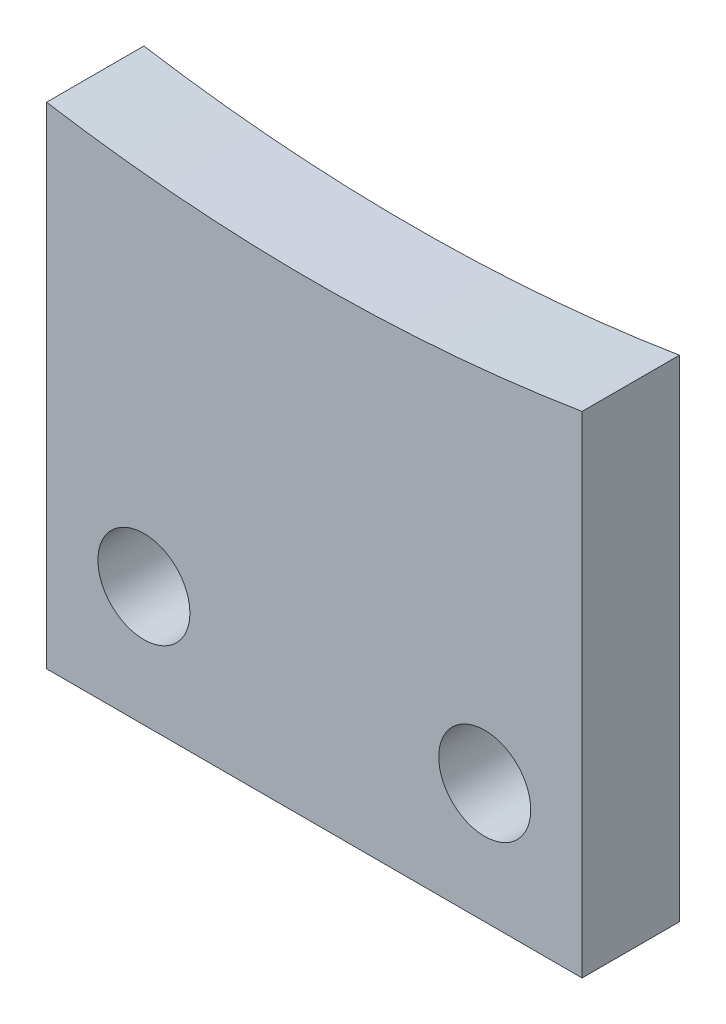
ISO-10303-21;
HEADER;
FILE_DESCRIPTION(('STEP AP214'),'2;1');
FILE_NAME('part.step','',(''),(''),'','','');
FILE_SCHEMA(('AUTOMOTIVE_DESIGN { 1 0 10303 214 1 1 1 1 }'));
ENDSEC;
DATA;
#1=APPLICATION_CONTEXT('core data for automotive mechanical design processes');
#2=APPLICATION_PROTOCOL_DEFINITION('international standard','automotive_design',2000,#1);
#3=PRODUCT_CONTEXT('',#1,'mechanical');
#4=PRODUCT('Part','Part','',(#3));
#5=PRODUCT_RELATED_PRODUCT_CATEGORY('part','',(#4));
#6=PRODUCT_DEFINITION_FORMATION('','',#4);
#7=PRODUCT_DEFINITION_CONTEXT('part definition',#1,'design');
#8=PRODUCT_DEFINITION('design','',#6,#7);
#9=PRODUCT_DEFINITION_SHAPE('','',#8);
#10=(LENGTH_UNIT() NAMED_UNIT(*) SI_UNIT(.MILLI.,.METRE.));
#11=(NAMED_UNIT(*) PLANE_ANGLE_UNIT() SI_UNIT($,.RADIAN.));
#12=(NAMED_UNIT(*) SI_UNIT($,.STERADIAN.) SOLID_ANGLE_UNIT());
#13=UNCERTAINTY_MEASURE_WITH_UNIT(LENGTH_MEASURE(1.E-05),#10,'distance_accuracy_value','');
#14=(GEOMETRIC_REPRESENTATION_CONTEXT(3) GLOBAL_UNCERTAINTY_ASSIGNED_CONTEXT((#13)) GLOBAL_UNIT_ASSIGNED_CONTEXT((#10,
#11,#12)) REPRESENTATION_CONTEXT('',''));
#15=CARTESIAN_POINT('',(0.,0.,0.));
#16=DIRECTION('',(0.,0.,1.));
#17=DIRECTION('',(1.,0.,0.));
#18=AXIS2_PLACEMENT_3D('',#15,#16,#17);
#19=CARTESIAN_POINT('',(-8.73125000000001,0.,3.175));
#20=DIRECTION('',(-1.,0.,0.));
#21=DIRECTION('',(0.,-1.,0.));
#22=AXIS2_PLACEMENT_3D('',#19,#20,#21);
#23=PLANE('',#22);
#24=DIRECTION('',(0.,1.,0.));
#25=VECTOR('',#24,1.);
#26=CARTESIAN_POINT('',(-8.73125000000001,0.,0.));
#27=LINE('',#26,#25);
#28=CARTESIAN_POINT('',(-8.73125,-69.5002470155279,0.));
#29=VERTEX_POINT('',#28);
#30=CARTESIAN_POINT('',(-8.73125,-53.5002470155279,0.));
#31=VERTEX_POINT('',#30);
#32=EDGE_CURVE('E106',#29,#31,#27,.T.);
#33=ORIENTED_EDGE('',*,*,#32,.F.);
#34=DIRECTION('',(0.,0.,-1.));
#35=VECTOR('',#34,1.);
#36=CARTESIAN_POINT('',(-8.73125,-69.5002470155279,3.175));
#37=LINE('',#36,#35);
#38=CARTESIAN_POINT('',(-8.73125,-69.5002470155279,3.175));
#39=VERTEX_POINT('',#38);
#40=EDGE_CURVE('E11',#39,#29,#37,.T.);
#41=ORIENTED_EDGE('',*,*,#40,.F.);
#42=DIRECTION('',(0.,1.,0.));
#43=VECTOR('',#42,1.);
#44=CARTESIAN_POINT('',(-8.73125000000001,0.,3.175));
#45=LINE('',#44,#43);
#46=CARTESIAN_POINT('',(-8.73125,-53.5002470155279,3.175));
#47=VERTEX_POINT('',#46);
#48=EDGE_CURVE('E90',#39,#47,#45,.T.);
#49=ORIENTED_EDGE('',*,*,#48,.T.);
#50=DIRECTION('',(0.,0.,-1.));
#51=VECTOR('',#50,1.);
#52=CARTESIAN_POINT('',(-8.73125,-53.5002470155279,3.175));
#53=LINE('',#52,#51);
#54=EDGE_CURVE('E52',#47,#31,#53,.T.);
#55=ORIENTED_EDGE('',*,*,#54,.T.);
#56=EDGE_LOOP('',(#33,#41,#49,#55));
#57=FACE_BOUND('',#56,.T.);
#58=ADVANCED_FACE('F35',(#57),#23,.T.);
#59=CARTESIAN_POINT('',(0.,-69.5002470155279,3.175));
#60=DIRECTION('',(0.,1.,0.));
#61=DIRECTION('',(0.,0.,1.));
#62=AXIS2_PLACEMENT_3D('',#59,#60,#61);
#63=PLANE('',#62);
#64=DIRECTION('',(1.,0.,0.));
#65=VECTOR('',#64,1.);
#66=CARTESIAN_POINT('',(0.,-69.5002470155279,0.));
#67=LINE('',#66,#65);
#68=CARTESIAN_POINT('',(8.73125,-69.5002470155279,0.));
#69=VERTEX_POINT('',#68);
#70=EDGE_CURVE('E95',#29,#69,#67,.T.);
#71=ORIENTED_EDGE('',*,*,#70,.T.);
#72=DIRECTION('',(0.,0.,-1.));
#73=VECTOR('',#72,1.);
#74=CARTESIAN_POINT('',(8.73125,-69.5002470155279,3.175));
#75=LINE('',#74,#73);
#76=CARTESIAN_POINT('',(8.73125,-69.5002470155279,3.175));
#77=VERTEX_POINT('',#76);
#78=EDGE_CURVE('E44',#77,#69,#75,.T.);
#79=ORIENTED_EDGE('',*,*,#78,.F.);
#80=DIRECTION('',(1.,0.,0.));
#81=VECTOR('',#80,1.);
#82=CARTESIAN_POINT('',(0.,-69.5002470155279,3.175));
#83=LINE('',#82,#81);
#84=EDGE_CURVE('E86',#39,#77,#83,.T.);
#85=ORIENTED_EDGE('',*,*,#84,.F.);
#86=ORIENTED_EDGE('',*,*,#40,.T.);
#87=EDGE_LOOP('',(#71,#79,#85,#86));
#88=FACE_BOUND('',#87,.T.);
#89=ADVANCED_FACE('F93',(#88),#63,.F.);
#90=CARTESIAN_POINT('',(8.73124999999999,0.,3.175));
#91=DIRECTION('',(-1.,0.,0.));
#92=DIRECTION('',(0.,-1.,0.));
#93=AXIS2_PLACEMENT_3D('',#90,#91,#92);
#94=PLANE('',#93);
#95=DIRECTION('',(0.,1.,0.));
#96=VECTOR('',#95,1.);
#97=CARTESIAN_POINT('',(8.73124999999999,0.,0.));
#98=LINE('',#97,#96);
#99=CARTESIAN_POINT('',(8.73125,-53.5002470155279,0.));
#100=VERTEX_POINT('',#99);
#101=EDGE_CURVE('E103',#69,#100,#98,.T.);
#102=ORIENTED_EDGE('',*,*,#101,.T.);
#103=DIRECTION('',(0.,0.,-1.));
#104=VECTOR('',#103,1.);
#105=CARTESIAN_POINT('',(8.73125,-53.5002470155279,3.175));
#106=LINE('',#105,#104);
#107=CARTESIAN_POINT('',(8.73125,-53.5002470155279,3.175));
#108=VERTEX_POINT('',#107);
#109=EDGE_CURVE('E66',#108,#100,#106,.T.);
#110=ORIENTED_EDGE('',*,*,#109,.F.);
#111=DIRECTION('',(0.,1.,0.));
#112=VECTOR('',#111,1.);
#113=CARTESIAN_POINT('',(8.73124999999999,0.,3.175));
#114=LINE('',#113,#112);
#115=EDGE_CURVE('E78',#77,#108,#114,.T.);
#116=ORIENTED_EDGE('',*,*,#115,.F.);
#117=ORIENTED_EDGE('',*,*,#78,.T.);
#118=EDGE_LOOP('',(#102,#110,#116,#117));
#119=FACE_BOUND('',#118,.T.);
#120=ADVANCED_FACE('F80',(#119),#94,.F.);
#121=CARTESIAN_POINT('',(-5.55625,-65.5893702655279,3.175));
#122=DIRECTION('',(0.,0.,-1.));
#123=DIRECTION('',(-1.,0.,0.));
#124=AXIS2_PLACEMENT_3D('',#121,#122,#123);
#125=CYLINDRICAL_SURFACE('',#124,1.5);
#126=CARTESIAN_POINT('',(-5.55625,-65.5893702655279,3.175));
#127=DIRECTION('',(0.,0.,1.));
#128=DIRECTION('',(1.,0.,0.));
#129=AXIS2_PLACEMENT_3D('',#126,#127,#128);
#130=CIRCLE('',#129,1.5);
#131=CARTESIAN_POINT('',(-4.05625,-65.5893702655279,3.175));
#132=VERTEX_POINT('',#131);
#133=EDGE_CURVE('E116',#132,#132,#130,.T.);
#134=ORIENTED_EDGE('',*,*,#133,.T.);
#135=EDGE_LOOP('',(#134));
#136=FACE_BOUND('',#135,.T.);
#137=CARTESIAN_POINT('',(-5.55625,-65.5893702655279,0.));
#138=DIRECTION('',(0.,0.,1.));
#139=DIRECTION('',(1.,0.,0.));
#140=AXIS2_PLACEMENT_3D('',#137,#138,#139);
#141=CIRCLE('',#140,1.5);
#142=CARTESIAN_POINT('',(-4.05625,-65.5893702655279,0.));
#143=VERTEX_POINT('',#142);
#144=EDGE_CURVE('E108',#143,#143,#141,.T.);
#145=ORIENTED_EDGE('',*,*,#144,.F.);
#146=EDGE_LOOP('',(#145));
#147=FACE_BOUND('',#146,.T.);
#148=ADVANCED_FACE('F131',(#136,#147),#125,.F.);
#149=CARTESIAN_POINT('',(5.55625,-65.5893702655279,3.175));
#150=DIRECTION('',(0.,0.,-1.));
#151=DIRECTION('',(-1.,0.,0.));
#152=AXIS2_PLACEMENT_3D('',#149,#150,#151);
#153=CYLINDRICAL_SURFACE('',#152,1.5);
#154=CARTESIAN_POINT('',(5.55625,-65.5893702655279,3.175));
#155=DIRECTION('',(0.,0.,1.));
#156=DIRECTION('',(1.,0.,0.));
#157=AXIS2_PLACEMENT_3D('',#154,#155,#156);
#158=CIRCLE('',#157,1.5);
#159=CARTESIAN_POINT('',(7.05625,-65.5893702655279,3.175));
#160=VERTEX_POINT('',#159);
#161=EDGE_CURVE('E102',#160,#160,#158,.T.);
#162=ORIENTED_EDGE('',*,*,#161,.T.);
#163=EDGE_LOOP('',(#162));
#164=FACE_BOUND('',#163,.T.);
#165=CARTESIAN_POINT('',(5.55625,-65.5893702655279,0.));
#166=DIRECTION('',(0.,0.,1.));
#167=DIRECTION('',(1.,0.,0.));
#168=AXIS2_PLACEMENT_3D('',#165,#166,#167);
#169=CIRCLE('',#168,1.5);
#170=CARTESIAN_POINT('',(7.05625,-65.5893702655279,0.));
#171=VERTEX_POINT('',#170);
#172=EDGE_CURVE('E111',#171,#171,#169,.T.);
#173=ORIENTED_EDGE('',*,*,#172,.F.);
#174=EDGE_LOOP('',(#173));
#175=FACE_BOUND('',#174,.T.);
#176=ADVANCED_FACE('F37',(#164,#175),#153,.F.);
#177=CARTESIAN_POINT('',(0.,0.,3.175));
#178=DIRECTION('',(0.,0.,-1.));
#179=DIRECTION('',(-1.,0.,0.));
#180=AXIS2_PLACEMENT_3D('',#177,#178,#179);
#181=CYLINDRICAL_SURFACE('',#180,54.2080359106009);
#182=CARTESIAN_POINT('',(0.,0.,0.));
#183=DIRECTION('',(0.,0.,1.));
#184=DIRECTION('',(1.,0.,0.));
#185=AXIS2_PLACEMENT_3D('',#182,#183,#184);
#186=CIRCLE('',#185,54.2080359106009);
#187=EDGE_CURVE('E99',#31,#100,#186,.T.);
#188=ORIENTED_EDGE('',*,*,#187,.F.);
#189=ORIENTED_EDGE('',*,*,#54,.F.);
#190=CARTESIAN_POINT('',(0.,0.,3.175));
#191=DIRECTION('',(0.,0.,1.));
#192=DIRECTION('',(1.,0.,0.));
#193=AXIS2_PLACEMENT_3D('',#190,#191,#192);
#194=CIRCLE('',#193,54.2080359106009);
#195=EDGE_CURVE('E85',#47,#108,#194,.T.);
#196=ORIENTED_EDGE('',*,*,#195,.T.);
#197=ORIENTED_EDGE('',*,*,#109,.T.);
#198=EDGE_LOOP('',(#188,#189,#196,#197));
#199=FACE_BOUND('',#198,.T.);
#200=ADVANCED_FACE('F127',(#199),#181,.F.);
#201=CARTESIAN_POINT('',(0.,0.,3.175));
#202=DIRECTION('',(0.,0.,1.));
#203=DIRECTION('',(1.,0.,0.));
#204=AXIS2_PLACEMENT_3D('',#201,#202,#203);
#205=PLANE('',#204);
#206=ORIENTED_EDGE('',*,*,#161,.F.);
#207=EDGE_LOOP('',(#206));
#208=FACE_BOUND('',#207,.T.);
#209=ORIENTED_EDGE('',*,*,#133,.F.);
#210=EDGE_LOOP('',(#209));
#211=FACE_BOUND('',#210,.T.);
#212=ORIENTED_EDGE('',*,*,#48,.F.);
#213=ORIENTED_EDGE('',*,*,#84,.T.);
#214=ORIENTED_EDGE('',*,*,#115,.T.);
#215=ORIENTED_EDGE('',*,*,#195,.F.);
#216=EDGE_LOOP('',(#212,#213,#214,#215));
#217=FACE_BOUND('',#216,.T.);
#218=ADVANCED_FACE('F89',(#208,#211,#217),#205,.T.);
#219=CARTESIAN_POINT('',(0.,0.,0.));
#220=DIRECTION('',(0.,0.,1.));
#221=DIRECTION('',(1.,0.,0.));
#222=AXIS2_PLACEMENT_3D('',#219,#220,#221);
#223=PLANE('',#222);
#224=ORIENTED_EDGE('',*,*,#172,.T.);
#225=EDGE_LOOP('',(#224));
#226=FACE_BOUND('',#225,.T.);
#227=ORIENTED_EDGE('',*,*,#144,.T.);
#228=EDGE_LOOP('',(#227));
#229=FACE_BOUND('',#228,.T.);
#230=ORIENTED_EDGE('',*,*,#32,.T.);
#231=ORIENTED_EDGE('',*,*,#187,.T.);
#232=ORIENTED_EDGE('',*,*,#101,.F.);
#233=ORIENTED_EDGE('',*,*,#70,.F.);
#234=EDGE_LOOP('',(#230,#231,#232,#233));
#235=FACE_BOUND('',#234,.T.);
#236=ADVANCED_FACE('F126',(#226,#229,#235),#223,.F.);
#237=CLOSED_SHELL('',(#58,#89,#120,#148,#176,#200,#218,#236));
#238=MANIFOLD_SOLID_BREP('B2',#237);
#239=ADVANCED_BREP_SHAPE_REPRESENTATION('',(#18,#238),#14);
#240=SHAPE_DEFINITION_REPRESENTATION(#9,#239);
ENDSEC;
END-ISO-10303-21;
